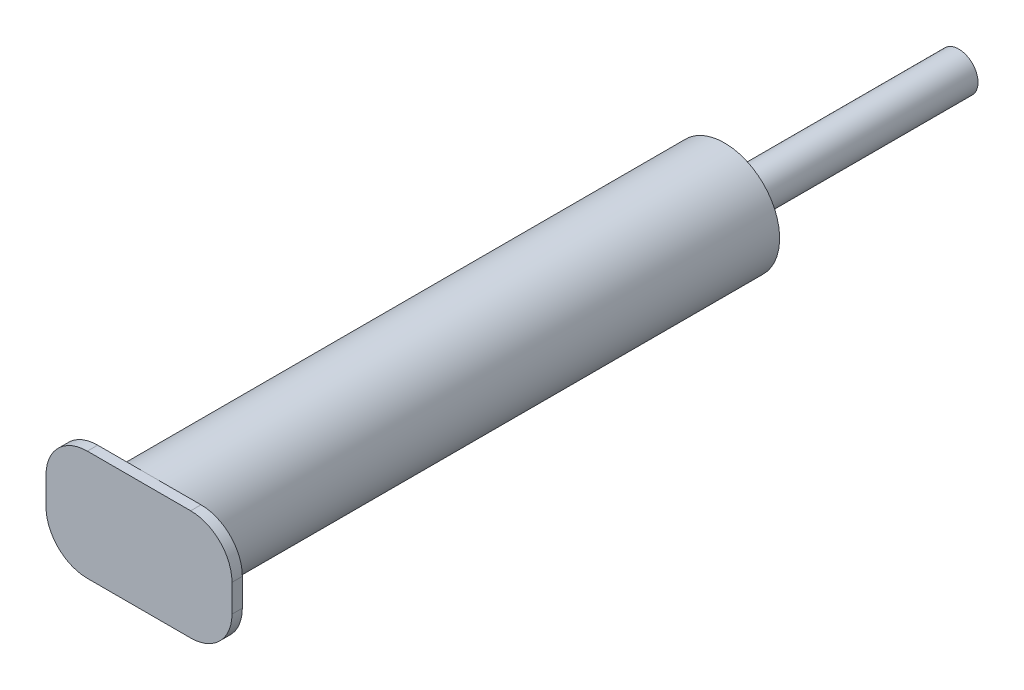
ISO-10303-21;
HEADER;
FILE_DESCRIPTION(('STEP AP214'),'2;1');
FILE_NAME('part.step','',(''),(''),'','','');
FILE_SCHEMA(('AUTOMOTIVE_DESIGN { 1 0 10303 214 1 1 1 1 }'));
ENDSEC;
DATA;
#1=APPLICATION_CONTEXT('core data for automotive mechanical design processes');
#2=APPLICATION_PROTOCOL_DEFINITION('international standard','automotive_design',2000,#1);
#3=PRODUCT_CONTEXT('',#1,'mechanical');
#4=PRODUCT('Part','Part','',(#3));
#5=PRODUCT_RELATED_PRODUCT_CATEGORY('part','',(#4));
#6=PRODUCT_DEFINITION_FORMATION('','',#4);
#7=PRODUCT_DEFINITION_CONTEXT('part definition',#1,'design');
#8=PRODUCT_DEFINITION('design','',#6,#7);
#9=PRODUCT_DEFINITION_SHAPE('','',#8);
#10=(LENGTH_UNIT() NAMED_UNIT(*) SI_UNIT(.MILLI.,.METRE.));
#11=(NAMED_UNIT(*) PLANE_ANGLE_UNIT() SI_UNIT($,.RADIAN.));
#12=(NAMED_UNIT(*) SI_UNIT($,.STERADIAN.) SOLID_ANGLE_UNIT());
#13=UNCERTAINTY_MEASURE_WITH_UNIT(LENGTH_MEASURE(1.E-05),#10,'distance_accuracy_value','');
#14=(GEOMETRIC_REPRESENTATION_CONTEXT(3) GLOBAL_UNCERTAINTY_ASSIGNED_CONTEXT((#13)) GLOBAL_UNIT_ASSIGNED_CONTEXT((#10,
#11,#12)) REPRESENTATION_CONTEXT('',''));
#15=CARTESIAN_POINT('',(0.,0.,0.));
#16=DIRECTION('',(0.,0.,1.));
#17=DIRECTION('',(1.,0.,0.));
#18=AXIS2_PLACEMENT_3D('',#15,#16,#17);
#19=CARTESIAN_POINT('',(0.,0.,85.));
#20=DIRECTION('',(0.,0.,-1.));
#21=DIRECTION('',(-1.,0.,0.));
#22=AXIS2_PLACEMENT_3D('',#19,#20,#21);
#23=CYLINDRICAL_SURFACE('',#22,8.);
#24=CARTESIAN_POINT('',(0.,0.,0.));
#25=DIRECTION('',(0.,0.,-1.));
#26=DIRECTION('',(-1.,0.,0.));
#27=AXIS2_PLACEMENT_3D('',#24,#25,#26);
#28=CIRCLE('',#27,8.);
#29=CARTESIAN_POINT('',(-8.,0.,0.));
#30=VERTEX_POINT('',#29);
#31=EDGE_CURVE('E188',#30,#30,#28,.T.);
#32=ORIENTED_EDGE('',*,*,#31,.F.);
#33=EDGE_LOOP('',(#32));
#34=FACE_BOUND('',#33,.T.);
#35=CARTESIAN_POINT('',(0.,0.,83.5));
#36=DIRECTION('',(0.,0.,1.));
#37=DIRECTION('',(1.,0.,0.));
#38=AXIS2_PLACEMENT_3D('',#35,#36,#37);
#39=CIRCLE('',#38,8.);
#40=CARTESIAN_POINT('',(0.,8.,83.5));
#41=VERTEX_POINT('',#40);
#42=CARTESIAN_POINT('',(0.,-7.99999999999999,83.5));
#43=VERTEX_POINT('',#42);
#44=EDGE_CURVE('E11',#41,#43,#39,.T.);
#45=ORIENTED_EDGE('',*,*,#44,.F.);
#46=EDGE_CURVE('E46',#43,#41,#39,.T.);
#47=ORIENTED_EDGE('',*,*,#46,.F.);
#48=EDGE_LOOP('',(#45,#47));
#49=FACE_BOUND('',#48,.T.);
#50=ADVANCED_FACE('F43',(#34,#49),#23,.T.);
#51=CARTESIAN_POINT('',(0.,0.,0.));
#52=DIRECTION('',(0.,0.,1.));
#53=DIRECTION('',(-1.,0.,0.));
#54=AXIS2_PLACEMENT_3D('',#51,#52,#53);
#55=CONICAL_SURFACE('',#54,8.,1.0471975511966);
#56=CARTESIAN_POINT('',(0.,0.,-3.));
#57=DIRECTION('',(0.,0.,-1.));
#58=DIRECTION('',(-1.,0.,0.));
#59=AXIS2_PLACEMENT_3D('',#56,#57,#58);
#60=CIRCLE('',#59,2.80384757729334);
#61=CARTESIAN_POINT('',(-2.80384757729334,0.,-3.));
#62=VERTEX_POINT('',#61);
#63=EDGE_CURVE('E190',#62,#62,#60,.T.);
#64=ORIENTED_EDGE('',*,*,#63,.F.);
#65=EDGE_LOOP('',(#64));
#66=FACE_BOUND('',#65,.T.);
#67=ORIENTED_EDGE('',*,*,#31,.T.);
#68=EDGE_LOOP('',(#67));
#69=FACE_BOUND('',#68,.T.);
#70=ADVANCED_FACE('F226',(#66,#69),#55,.T.);
#71=CARTESIAN_POINT('',(0.,0.,-34.));
#72=DIRECTION('',(0.,0.,1.));
#73=DIRECTION('',(1.,0.,0.));
#74=AXIS2_PLACEMENT_3D('',#71,#72,#73);
#75=CYLINDRICAL_SURFACE('',#74,2.80384757729334);
#76=CARTESIAN_POINT('',(0.,0.,-34.));
#77=DIRECTION('',(0.,0.,-1.));
#78=DIRECTION('',(-1.,0.,0.));
#79=AXIS2_PLACEMENT_3D('',#76,#77,#78);
#80=CIRCLE('',#79,2.80384757729334);
#81=CARTESIAN_POINT('',(-2.80384757729334,0.,-34.));
#82=VERTEX_POINT('',#81);
#83=EDGE_CURVE('E172',#82,#82,#80,.T.);
#84=ORIENTED_EDGE('',*,*,#83,.F.);
#85=EDGE_LOOP('',(#84));
#86=FACE_BOUND('',#85,.T.);
#87=ORIENTED_EDGE('',*,*,#63,.T.);
#88=EDGE_LOOP('',(#87));
#89=FACE_BOUND('',#88,.T.);
#90=ADVANCED_FACE('F233',(#86,#89),#75,.T.);
#91=CARTESIAN_POINT('',(0.,0.,-34.));
#92=DIRECTION('',(0.,0.,-1.));
#93=DIRECTION('',(-1.,0.,0.));
#94=AXIS2_PLACEMENT_3D('',#91,#92,#93);
#95=PLANE('',#94);
#96=ORIENTED_EDGE('',*,*,#83,.T.);
#97=EDGE_LOOP('',(#96));
#98=FACE_BOUND('',#97,.T.);
#99=ADVANCED_FACE('F241',(#98),#95,.T.);
#100=CARTESIAN_POINT('',(-7.5,-2.,83.5));
#101=DIRECTION('',(0.,0.,1.));
#102=DIRECTION('',(1.,0.,0.));
#103=AXIS2_PLACEMENT_3D('',#100,#101,#102);
#104=PLANE('',#103);
#105=DIRECTION('',(-1.,0.,0.));
#106=VECTOR('',#105,1.);
#107=CARTESIAN_POINT('',(-7.49999999999996,8.,83.5));
#108=LINE('',#107,#106);
#109=CARTESIAN_POINT('',(-7.49999999999996,8.,83.5));
#110=VERTEX_POINT('',#109);
#111=EDGE_CURVE('E147',#41,#110,#108,.T.);
#112=ORIENTED_EDGE('',*,*,#111,.F.);
#113=ORIENTED_EDGE('',*,*,#44,.T.);
#114=DIRECTION('',(1.,0.,0.));
#115=VECTOR('',#114,1.);
#116=CARTESIAN_POINT('',(-7.49999999999996,-8.,83.5));
#117=LINE('',#116,#115);
#118=CARTESIAN_POINT('',(-7.49999999999996,-8.,83.5));
#119=VERTEX_POINT('',#118);
#120=EDGE_CURVE('E110',#119,#43,#117,.T.);
#121=ORIENTED_EDGE('',*,*,#120,.F.);
#122=CARTESIAN_POINT('',(-7.5,-2.,83.5));
#123=DIRECTION('',(0.,0.,1.));
#124=DIRECTION('',(1.,0.,0.));
#125=AXIS2_PLACEMENT_3D('',#122,#123,#124);
#126=CIRCLE('',#125,6.);
#127=CARTESIAN_POINT('',(-13.5,-1.99999999999996,83.5));
#128=VERTEX_POINT('',#127);
#129=EDGE_CURVE('E125',#128,#119,#126,.T.);
#130=ORIENTED_EDGE('',*,*,#129,.F.);
#131=DIRECTION('',(0.,-1.,0.));
#132=VECTOR('',#131,1.);
#133=CARTESIAN_POINT('',(-13.5,1.99999999999996,83.5));
#134=LINE('',#133,#132);
#135=CARTESIAN_POINT('',(-13.5,1.99999999999996,83.5));
#136=VERTEX_POINT('',#135);
#137=EDGE_CURVE('E118',#136,#128,#134,.T.);
#138=ORIENTED_EDGE('',*,*,#137,.F.);
#139=CARTESIAN_POINT('',(-7.50000000000001,2.,83.5));
#140=DIRECTION('',(0.,0.,1.));
#141=DIRECTION('',(1.,0.,0.));
#142=AXIS2_PLACEMENT_3D('',#139,#140,#141);
#143=CIRCLE('',#142,6.);
#144=EDGE_CURVE('E151',#110,#136,#143,.T.);
#145=ORIENTED_EDGE('',*,*,#144,.F.);
#146=EDGE_LOOP('',(#112,#113,#121,#130,#138,#145));
#147=FACE_BOUND('',#146,.T.);
#148=ADVANCED_FACE('F123',(#147),#104,.F.);
#149=CARTESIAN_POINT('',(-7.49999999999996,8.,83.5));
#150=DIRECTION('',(0.,1.,0.));
#151=DIRECTION('',(0.,0.,1.));
#152=AXIS2_PLACEMENT_3D('',#149,#150,#151);
#153=PLANE('',#152);
#154=CARTESIAN_POINT('',(7.49999999999995,8.,83.5));
#155=VERTEX_POINT('',#154);
#156=EDGE_CURVE('E148',#155,#41,#108,.T.);
#157=ORIENTED_EDGE('',*,*,#156,.T.);
#158=ORIENTED_EDGE('',*,*,#111,.T.);
#159=DIRECTION('',(0.,0.,1.));
#160=VECTOR('',#159,1.);
#161=CARTESIAN_POINT('',(-7.49999999999996,8.,83.5));
#162=LINE('',#161,#160);
#163=CARTESIAN_POINT('',(-7.49999999999996,8.,85.));
#164=VERTEX_POINT('',#163);
#165=EDGE_CURVE('E175',#110,#164,#162,.T.);
#166=ORIENTED_EDGE('',*,*,#165,.T.);
#167=DIRECTION('',(-1.,0.,0.));
#168=VECTOR('',#167,1.);
#169=CARTESIAN_POINT('',(-7.49999999999996,8.,85.));
#170=LINE('',#169,#168);
#171=CARTESIAN_POINT('',(7.49999999999995,8.,85.));
#172=VERTEX_POINT('',#171);
#173=EDGE_CURVE('E167',#172,#164,#170,.T.);
#174=ORIENTED_EDGE('',*,*,#173,.F.);
#175=DIRECTION('',(0.,0.,1.));
#176=VECTOR('',#175,1.);
#177=CARTESIAN_POINT('',(7.49999999999995,8.,83.5));
#178=LINE('',#177,#176);
#179=EDGE_CURVE('E178',#155,#172,#178,.T.);
#180=ORIENTED_EDGE('',*,*,#179,.F.);
#181=EDGE_LOOP('',(#157,#158,#166,#174,#180));
#182=FACE_BOUND('',#181,.T.);
#183=ADVANCED_FACE('F202',(#182),#153,.T.);
#184=CARTESIAN_POINT('',(-7.49999999999996,-8.,83.5));
#185=DIRECTION('',(0.,-1.,0.));
#186=DIRECTION('',(0.,0.,-1.));
#187=AXIS2_PLACEMENT_3D('',#184,#185,#186);
#188=PLANE('',#187);
#189=ORIENTED_EDGE('',*,*,#120,.T.);
#190=CARTESIAN_POINT('',(7.49999999999995,-8.,83.5));
#191=VERTEX_POINT('',#190);
#192=EDGE_CURVE('E129',#43,#191,#117,.T.);
#193=ORIENTED_EDGE('',*,*,#192,.T.);
#194=DIRECTION('',(0.,0.,1.));
#195=VECTOR('',#194,1.);
#196=CARTESIAN_POINT('',(7.49999999999995,-8.,83.5));
#197=LINE('',#196,#195);
#198=CARTESIAN_POINT('',(7.49999999999995,-8.,85.));
#199=VERTEX_POINT('',#198);
#200=EDGE_CURVE('E117',#191,#199,#197,.T.);
#201=ORIENTED_EDGE('',*,*,#200,.T.);
#202=DIRECTION('',(1.,0.,0.));
#203=VECTOR('',#202,1.);
#204=CARTESIAN_POINT('',(-7.49999999999996,-8.,85.));
#205=LINE('',#204,#203);
#206=CARTESIAN_POINT('',(-7.49999999999996,-8.,85.));
#207=VERTEX_POINT('',#206);
#208=EDGE_CURVE('E112',#207,#199,#205,.T.);
#209=ORIENTED_EDGE('',*,*,#208,.F.);
#210=DIRECTION('',(0.,0.,1.));
#211=VECTOR('',#210,1.);
#212=CARTESIAN_POINT('',(-7.49999999999996,-8.,83.5));
#213=LINE('',#212,#211);
#214=EDGE_CURVE('E107',#119,#207,#213,.T.);
#215=ORIENTED_EDGE('',*,*,#214,.F.);
#216=EDGE_LOOP('',(#189,#193,#201,#209,#215));
#217=FACE_BOUND('',#216,.T.);
#218=ADVANCED_FACE('F109',(#217),#188,.T.);
#219=CARTESIAN_POINT('',(-7.5,-2.,83.5));
#220=DIRECTION('',(0.,0.,1.));
#221=DIRECTION('',(1.,0.,0.));
#222=AXIS2_PLACEMENT_3D('',#219,#220,#221);
#223=CYLINDRICAL_SURFACE('',#222,6.);
#224=CARTESIAN_POINT('',(-7.5,-2.,85.));
#225=DIRECTION('',(0.,0.,1.));
#226=DIRECTION('',(1.,0.,0.));
#227=AXIS2_PLACEMENT_3D('',#224,#225,#226);
#228=CIRCLE('',#227,6.);
#229=CARTESIAN_POINT('',(-13.5,-1.99999999999996,85.));
#230=VERTEX_POINT('',#229);
#231=EDGE_CURVE('E155',#230,#207,#228,.T.);
#232=ORIENTED_EDGE('',*,*,#231,.F.);
#233=DIRECTION('',(0.,0.,1.));
#234=VECTOR('',#233,1.);
#235=CARTESIAN_POINT('',(-13.5,-1.99999999999996,83.5));
#236=LINE('',#235,#234);
#237=EDGE_CURVE('E132',#128,#230,#236,.T.);
#238=ORIENTED_EDGE('',*,*,#237,.F.);
#239=ORIENTED_EDGE('',*,*,#129,.T.);
#240=ORIENTED_EDGE('',*,*,#214,.T.);
#241=EDGE_LOOP('',(#232,#238,#239,#240));
#242=FACE_BOUND('',#241,.T.);
#243=ADVANCED_FACE('F131',(#242),#223,.T.);
#244=CARTESIAN_POINT('',(-13.5,1.99999999999996,83.5));
#245=DIRECTION('',(-1.,0.,0.));
#246=DIRECTION('',(0.,0.,1.));
#247=AXIS2_PLACEMENT_3D('',#244,#245,#246);
#248=PLANE('',#247);
#249=DIRECTION('',(0.,-1.,0.));
#250=VECTOR('',#249,1.);
#251=CARTESIAN_POINT('',(-13.5,1.99999999999996,85.));
#252=LINE('',#251,#250);
#253=CARTESIAN_POINT('',(-13.5,1.99999999999996,85.));
#254=VERTEX_POINT('',#253);
#255=EDGE_CURVE('E133',#254,#230,#252,.T.);
#256=ORIENTED_EDGE('',*,*,#255,.F.);
#257=DIRECTION('',(0.,0.,1.));
#258=VECTOR('',#257,1.);
#259=CARTESIAN_POINT('',(-13.5,1.99999999999996,83.5));
#260=LINE('',#259,#258);
#261=EDGE_CURVE('E173',#136,#254,#260,.T.);
#262=ORIENTED_EDGE('',*,*,#261,.F.);
#263=ORIENTED_EDGE('',*,*,#137,.T.);
#264=ORIENTED_EDGE('',*,*,#237,.T.);
#265=EDGE_LOOP('',(#256,#262,#263,#264));
#266=FACE_BOUND('',#265,.T.);
#267=ADVANCED_FACE('F282',(#266),#248,.T.);
#268=CARTESIAN_POINT('',(-7.50000000000001,2.,83.5));
#269=DIRECTION('',(0.,0.,1.));
#270=DIRECTION('',(1.,0.,0.));
#271=AXIS2_PLACEMENT_3D('',#268,#269,#270);
#272=CYLINDRICAL_SURFACE('',#271,6.);
#273=CARTESIAN_POINT('',(-7.50000000000001,2.,85.));
#274=DIRECTION('',(0.,0.,1.));
#275=DIRECTION('',(1.,0.,0.));
#276=AXIS2_PLACEMENT_3D('',#273,#274,#275);
#277=CIRCLE('',#276,6.);
#278=EDGE_CURVE('E136',#164,#254,#277,.T.);
#279=ORIENTED_EDGE('',*,*,#278,.F.);
#280=ORIENTED_EDGE('',*,*,#165,.F.);
#281=ORIENTED_EDGE('',*,*,#144,.T.);
#282=ORIENTED_EDGE('',*,*,#261,.T.);
#283=EDGE_LOOP('',(#279,#280,#281,#282));
#284=FACE_BOUND('',#283,.T.);
#285=ADVANCED_FACE('F273',(#284),#272,.T.);
#286=CARTESIAN_POINT('',(7.5,2.,83.5));
#287=DIRECTION('',(0.,0.,1.));
#288=DIRECTION('',(1.,0.,0.));
#289=AXIS2_PLACEMENT_3D('',#286,#287,#288);
#290=CYLINDRICAL_SURFACE('',#289,6.);
#291=CARTESIAN_POINT('',(7.5,2.,85.));
#292=DIRECTION('',(0.,0.,1.));
#293=DIRECTION('',(-1.,0.,0.));
#294=AXIS2_PLACEMENT_3D('',#291,#292,#293);
#295=CIRCLE('',#294,6.);
#296=CARTESIAN_POINT('',(13.5,1.99999999999996,85.));
#297=VERTEX_POINT('',#296);
#298=EDGE_CURVE('E164',#297,#172,#295,.T.);
#299=ORIENTED_EDGE('',*,*,#298,.F.);
#300=DIRECTION('',(0.,0.,1.));
#301=VECTOR('',#300,1.);
#302=CARTESIAN_POINT('',(13.5,1.99999999999996,83.5));
#303=LINE('',#302,#301);
#304=CARTESIAN_POINT('',(13.5,1.99999999999996,83.5));
#305=VERTEX_POINT('',#304);
#306=EDGE_CURVE('E181',#305,#297,#303,.T.);
#307=ORIENTED_EDGE('',*,*,#306,.F.);
#308=CARTESIAN_POINT('',(7.5,2.,83.5));
#309=DIRECTION('',(0.,0.,1.));
#310=DIRECTION('',(-1.,0.,0.));
#311=AXIS2_PLACEMENT_3D('',#308,#309,#310);
#312=CIRCLE('',#311,6.);
#313=EDGE_CURVE('E144',#305,#155,#312,.T.);
#314=ORIENTED_EDGE('',*,*,#313,.T.);
#315=ORIENTED_EDGE('',*,*,#179,.T.);
#316=EDGE_LOOP('',(#299,#307,#314,#315));
#317=FACE_BOUND('',#316,.T.);
#318=ADVANCED_FACE('F205',(#317),#290,.T.);
#319=CARTESIAN_POINT('',(13.5,1.99999999999996,83.5));
#320=DIRECTION('',(1.,0.,0.));
#321=DIRECTION('',(0.,0.,-1.));
#322=AXIS2_PLACEMENT_3D('',#319,#320,#321);
#323=PLANE('',#322);
#324=DIRECTION('',(0.,1.,0.));
#325=VECTOR('',#324,1.);
#326=CARTESIAN_POINT('',(13.5,1.99999999999996,85.));
#327=LINE('',#326,#325);
#328=CARTESIAN_POINT('',(13.5,-1.99999999999996,85.));
#329=VERTEX_POINT('',#328);
#330=EDGE_CURVE('E161',#329,#297,#327,.T.);
#331=ORIENTED_EDGE('',*,*,#330,.F.);
#332=DIRECTION('',(0.,0.,1.));
#333=VECTOR('',#332,1.);
#334=CARTESIAN_POINT('',(13.5,-1.99999999999996,83.5));
#335=LINE('',#334,#333);
#336=CARTESIAN_POINT('',(13.5,-1.99999999999996,83.5));
#337=VERTEX_POINT('',#336);
#338=EDGE_CURVE('E183',#337,#329,#335,.T.);
#339=ORIENTED_EDGE('',*,*,#338,.F.);
#340=DIRECTION('',(0.,1.,0.));
#341=VECTOR('',#340,1.);
#342=CARTESIAN_POINT('',(13.5,1.99999999999996,83.5));
#343=LINE('',#342,#341);
#344=EDGE_CURVE('E141',#337,#305,#343,.T.);
#345=ORIENTED_EDGE('',*,*,#344,.T.);
#346=ORIENTED_EDGE('',*,*,#306,.T.);
#347=EDGE_LOOP('',(#331,#339,#345,#346));
#348=FACE_BOUND('',#347,.T.);
#349=ADVANCED_FACE('F211',(#348),#323,.T.);
#350=CARTESIAN_POINT('',(7.5,-2.,83.5));
#351=DIRECTION('',(0.,0.,1.));
#352=DIRECTION('',(1.,0.,0.));
#353=AXIS2_PLACEMENT_3D('',#350,#351,#352);
#354=CYLINDRICAL_SURFACE('',#353,6.);
#355=CARTESIAN_POINT('',(7.5,-2.,85.));
#356=DIRECTION('',(0.,0.,1.));
#357=DIRECTION('',(1.,0.,0.));
#358=AXIS2_PLACEMENT_3D('',#355,#356,#357);
#359=CIRCLE('',#358,6.);
#360=EDGE_CURVE('E158',#199,#329,#359,.T.);
#361=ORIENTED_EDGE('',*,*,#360,.F.);
#362=ORIENTED_EDGE('',*,*,#200,.F.);
#363=CARTESIAN_POINT('',(7.5,-2.,83.5));
#364=DIRECTION('',(0.,0.,1.));
#365=DIRECTION('',(1.,0.,0.));
#366=AXIS2_PLACEMENT_3D('',#363,#364,#365);
#367=CIRCLE('',#366,6.);
#368=EDGE_CURVE('E128',#191,#337,#367,.T.);
#369=ORIENTED_EDGE('',*,*,#368,.T.);
#370=ORIENTED_EDGE('',*,*,#338,.T.);
#371=EDGE_LOOP('',(#361,#362,#369,#370));
#372=FACE_BOUND('',#371,.T.);
#373=ADVANCED_FACE('F215',(#372),#354,.T.);
#374=ORIENTED_EDGE('',*,*,#192,.F.);
#375=ORIENTED_EDGE('',*,*,#46,.T.);
#376=ORIENTED_EDGE('',*,*,#156,.F.);
#377=ORIENTED_EDGE('',*,*,#313,.F.);
#378=ORIENTED_EDGE('',*,*,#344,.F.);
#379=ORIENTED_EDGE('',*,*,#368,.F.);
#380=EDGE_LOOP('',(#374,#375,#376,#377,#378,#379));
#381=FACE_BOUND('',#380,.T.);
#382=ADVANCED_FACE('F196',(#381),#104,.F.);
#383=CARTESIAN_POINT('',(0.,0.,85.));
#384=DIRECTION('',(0.,0.,1.));
#385=DIRECTION('',(1.,0.,0.));
#386=AXIS2_PLACEMENT_3D('',#383,#384,#385);
#387=PLANE('',#386);
#388=ORIENTED_EDGE('',*,*,#298,.T.);
#389=ORIENTED_EDGE('',*,*,#173,.T.);
#390=ORIENTED_EDGE('',*,*,#278,.T.);
#391=ORIENTED_EDGE('',*,*,#255,.T.);
#392=ORIENTED_EDGE('',*,*,#231,.T.);
#393=ORIENTED_EDGE('',*,*,#208,.T.);
#394=ORIENTED_EDGE('',*,*,#360,.T.);
#395=ORIENTED_EDGE('',*,*,#330,.T.);
#396=EDGE_LOOP('',(#388,#389,#390,#391,#392,#393,#394,#395));
#397=FACE_BOUND('',#396,.T.);
#398=ADVANCED_FACE('F207',(#397),#387,.T.);
#399=CLOSED_SHELL('',(#50,#70,#90,#99,#148,#183,#218,#243,#267,#285,#318,#349,#373,#382,#398));
#400=MANIFOLD_SOLID_BREP('B2',#399);
#401=ADVANCED_BREP_SHAPE_REPRESENTATION('',(#18,#400),#14);
#402=SHAPE_DEFINITION_REPRESENTATION(#9,#401);
ENDSEC;
END-ISO-10303-21;
